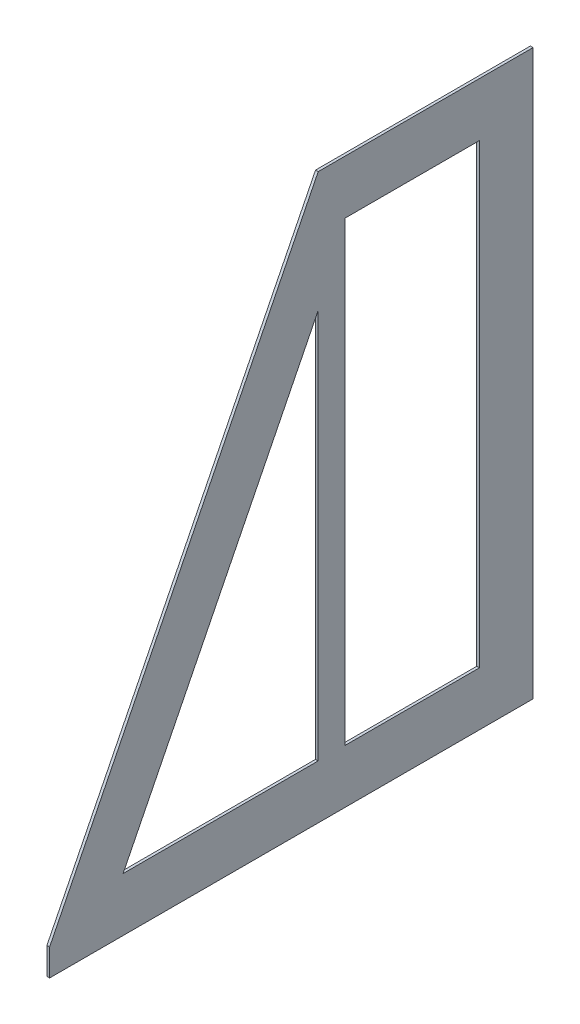
ISO-10303-21;
HEADER;
FILE_DESCRIPTION(('STEP AP214'),'2;1');
FILE_NAME('part.step','',(''),(''),'','','');
FILE_SCHEMA(('AUTOMOTIVE_DESIGN { 1 0 10303 214 1 1 1 1 }'));
ENDSEC;
DATA;
#1=APPLICATION_CONTEXT('core data for automotive mechanical design processes');
#2=APPLICATION_PROTOCOL_DEFINITION('international standard','automotive_design',2000,#1);
#3=PRODUCT_CONTEXT('',#1,'mechanical');
#4=PRODUCT('Part','Part','',(#3));
#5=PRODUCT_RELATED_PRODUCT_CATEGORY('part','',(#4));
#6=PRODUCT_DEFINITION_FORMATION('','',#4);
#7=PRODUCT_DEFINITION_CONTEXT('part definition',#1,'design');
#8=PRODUCT_DEFINITION('design','',#6,#7);
#9=PRODUCT_DEFINITION_SHAPE('','',#8);
#10=(LENGTH_UNIT() NAMED_UNIT(*) SI_UNIT(.MILLI.,.METRE.));
#11=(NAMED_UNIT(*) PLANE_ANGLE_UNIT() SI_UNIT($,.RADIAN.));
#12=(NAMED_UNIT(*) SI_UNIT($,.STERADIAN.) SOLID_ANGLE_UNIT());
#13=UNCERTAINTY_MEASURE_WITH_UNIT(LENGTH_MEASURE(1.E-05),#10,'distance_accuracy_value','');
#14=(GEOMETRIC_REPRESENTATION_CONTEXT(3) GLOBAL_UNCERTAINTY_ASSIGNED_CONTEXT((#13)) GLOBAL_UNIT_ASSIGNED_CONTEXT((#10,
#11,#12)) REPRESENTATION_CONTEXT('',''));
#15=CARTESIAN_POINT('',(0.,0.,0.));
#16=DIRECTION('',(0.,0.,1.));
#17=DIRECTION('',(1.,0.,0.));
#18=AXIS2_PLACEMENT_3D('',#15,#16,#17);
#19=CARTESIAN_POINT('',(2.54,0.,0.));
#20=DIRECTION('',(-1.,0.,0.));
#21=DIRECTION('',(0.,0.,1.));
#22=AXIS2_PLACEMENT_3D('',#19,#20,#21);
#23=PLANE('',#22);
#24=DIRECTION('',(0.,0.,1.));
#25=VECTOR('',#24,1.);
#26=CARTESIAN_POINT('',(2.54,336.442597926244,42.0659071977671));
#27=LINE('',#26,#25);
#28=CARTESIAN_POINT('',(2.54,336.442597926244,-84.9340928022328));
#29=VERTEX_POINT('',#28);
#30=CARTESIAN_POINT('',(2.54,336.442597926244,42.0659071977671));
#31=VERTEX_POINT('',#30);
#32=EDGE_CURVE('E151',#29,#31,#27,.T.);
#33=ORIENTED_EDGE('',*,*,#32,.F.);
#34=DIRECTION('',(0.,1.,0.));
#35=VECTOR('',#34,1.);
#36=CARTESIAN_POINT('',(2.54,336.442597926244,-84.9340928022328));
#37=LINE('',#36,#35);
#38=CARTESIAN_POINT('',(2.54,-95.3574020737564,-84.9340928022329));
#39=VERTEX_POINT('',#38);
#40=EDGE_CURVE('E159',#39,#29,#37,.T.);
#41=ORIENTED_EDGE('',*,*,#40,.F.);
#42=DIRECTION('',(0.,0.,-1.));
#43=VECTOR('',#42,1.);
#44=CARTESIAN_POINT('',(2.54,-95.3574020737564,-84.9340928022329));
#45=LINE('',#44,#43);
#46=CARTESIAN_POINT('',(2.54,-95.3574020737564,42.0659071977671));
#47=VERTEX_POINT('',#46);
#48=EDGE_CURVE('E156',#47,#39,#45,.T.);
#49=ORIENTED_EDGE('',*,*,#48,.F.);
#50=DIRECTION('',(0.,-1.,0.));
#51=VECTOR('',#50,1.);
#52=CARTESIAN_POINT('',(2.54,-95.3574020737564,42.0659071977671));
#53=LINE('',#52,#51);
#54=EDGE_CURVE('E153',#31,#47,#53,.T.);
#55=ORIENTED_EDGE('',*,*,#54,.F.);
#56=EDGE_LOOP('',(#33,#41,#49,#55));
#57=FACE_BOUND('',#56,.T.);
#58=DIRECTION('',(0.,-0.894427190999916,0.447213595499957));
#59=VECTOR('',#58,1.);
#60=CARTESIAN_POINT('',(2.54,-120.757402073757,321.465907197767));
#61=LINE('',#60,#59);
#62=CARTESIAN_POINT('',(2.54,387.242597926244,67.4659071977672));
#63=VERTEX_POINT('',#62);
#64=CARTESIAN_POINT('',(2.54,-120.757402073757,321.465907197767));
#65=VERTEX_POINT('',#64);
#66=EDGE_CURVE('E182',#63,#65,#61,.T.);
#67=ORIENTED_EDGE('',*,*,#66,.T.);
#68=DIRECTION('',(0.,-1.,0.));
#69=VECTOR('',#68,1.);
#70=CARTESIAN_POINT('',(2.54,-146.157402073756,321.465907197767));
#71=LINE('',#70,#69);
#72=CARTESIAN_POINT('',(2.54,-146.157402073756,321.465907197767));
#73=VERTEX_POINT('',#72);
#74=EDGE_CURVE('E185',#65,#73,#71,.T.);
#75=ORIENTED_EDGE('',*,*,#74,.T.);
#76=DIRECTION('',(0.,0.,-1.));
#77=VECTOR('',#76,1.);
#78=CARTESIAN_POINT('',(2.54,-146.157402073756,-135.734092802233));
#79=LINE('',#78,#77);
#80=CARTESIAN_POINT('',(2.54,-146.157402073756,-135.734092802233));
#81=VERTEX_POINT('',#80);
#82=EDGE_CURVE('E188',#73,#81,#79,.T.);
#83=ORIENTED_EDGE('',*,*,#82,.T.);
#84=DIRECTION('',(0.,1.,0.));
#85=VECTOR('',#84,1.);
#86=CARTESIAN_POINT('',(2.54,387.242597926244,-135.734092802233));
#87=LINE('',#86,#85);
#88=CARTESIAN_POINT('',(2.54,387.242597926244,-135.734092802233));
#89=VERTEX_POINT('',#88);
#90=EDGE_CURVE('E190',#81,#89,#87,.T.);
#91=ORIENTED_EDGE('',*,*,#90,.T.);
#92=DIRECTION('',(0.,0.,1.));
#93=VECTOR('',#92,1.);
#94=CARTESIAN_POINT('',(2.54,387.242597926244,67.4659071977672));
#95=LINE('',#94,#93);
#96=EDGE_CURVE('E192',#89,#63,#95,.T.);
#97=ORIENTED_EDGE('',*,*,#96,.T.);
#98=EDGE_LOOP('',(#67,#75,#83,#91,#97));
#99=FACE_BOUND('',#98,.T.);
#100=DIRECTION('',(0.,1.,0.));
#101=VECTOR('',#100,1.);
#102=CARTESIAN_POINT('',(2.54,-95.3574020737564,67.4659071977671));
#103=LINE('',#102,#101);
#104=CARTESIAN_POINT('',(2.54,-95.3574020737564,67.4659071977671));
#105=VERTEX_POINT('',#104);
#106=CARTESIAN_POINT('',(2.54,273.650344669254,67.4659071977671));
#107=VERTEX_POINT('',#106);
#108=EDGE_CURVE('E124',#105,#107,#103,.T.);
#109=ORIENTED_EDGE('',*,*,#108,.F.);
#110=DIRECTION('',(0.,0.,-1.));
#111=VECTOR('',#110,1.);
#112=CARTESIAN_POINT('',(2.54,-95.3574020737564,251.969780569272));
#113=LINE('',#112,#111);
#114=CARTESIAN_POINT('',(2.54,-95.3574020737564,251.969780569272));
#115=VERTEX_POINT('',#114);
#116=EDGE_CURVE('E141',#115,#105,#113,.T.);
#117=ORIENTED_EDGE('',*,*,#116,.F.);
#118=DIRECTION('',(0.,-0.894427190999916,0.447213595499958));
#119=VECTOR('',#118,1.);
#120=CARTESIAN_POINT('',(2.54,273.650344669254,67.4659071977671));
#121=LINE('',#120,#119);
#122=EDGE_CURVE('E132',#107,#115,#121,.T.);
#123=ORIENTED_EDGE('',*,*,#122,.F.);
#124=EDGE_LOOP('',(#109,#117,#123));
#125=FACE_BOUND('',#124,.T.);
#126=ADVANCED_FACE('F35',(#57,#99,#125),#23,.F.);
#127=CARTESIAN_POINT('',(0.,0.,0.));
#128=DIRECTION('',(-1.,0.,0.));
#129=DIRECTION('',(0.,0.,1.));
#130=AXIS2_PLACEMENT_3D('',#127,#128,#129);
#131=PLANE('',#130);
#132=DIRECTION('',(0.,-0.894427190999916,0.447213595499957));
#133=VECTOR('',#132,1.);
#134=CARTESIAN_POINT('',(0.,-120.757402073757,321.465907197767));
#135=LINE('',#134,#133);
#136=CARTESIAN_POINT('',(0.,387.242597926244,67.4659071977672));
#137=VERTEX_POINT('',#136);
#138=CARTESIAN_POINT('',(0.,-120.757402073757,321.465907197767));
#139=VERTEX_POINT('',#138);
#140=EDGE_CURVE('E181',#137,#139,#135,.T.);
#141=ORIENTED_EDGE('',*,*,#140,.F.);
#142=DIRECTION('',(0.,0.,1.));
#143=VECTOR('',#142,1.);
#144=CARTESIAN_POINT('',(0.,387.242597926244,67.4659071977672));
#145=LINE('',#144,#143);
#146=CARTESIAN_POINT('',(0.,387.242597926244,-135.734092802233));
#147=VERTEX_POINT('',#146);
#148=EDGE_CURVE('E186',#147,#137,#145,.T.);
#149=ORIENTED_EDGE('',*,*,#148,.F.);
#150=DIRECTION('',(0.,1.,0.));
#151=VECTOR('',#150,1.);
#152=CARTESIAN_POINT('',(0.,387.242597926244,-135.734092802233));
#153=LINE('',#152,#151);
#154=CARTESIAN_POINT('',(0.,-146.157402073756,-135.734092802233));
#155=VERTEX_POINT('',#154);
#156=EDGE_CURVE('E201',#155,#147,#153,.T.);
#157=ORIENTED_EDGE('',*,*,#156,.F.);
#158=DIRECTION('',(0.,0.,-1.));
#159=VECTOR('',#158,1.);
#160=CARTESIAN_POINT('',(0.,-146.157402073756,-135.734092802233));
#161=LINE('',#160,#159);
#162=CARTESIAN_POINT('',(0.,-146.157402073756,321.465907197767));
#163=VERTEX_POINT('',#162);
#164=EDGE_CURVE('E199',#163,#155,#161,.T.);
#165=ORIENTED_EDGE('',*,*,#164,.F.);
#166=DIRECTION('',(0.,-1.,0.));
#167=VECTOR('',#166,1.);
#168=CARTESIAN_POINT('',(0.,-146.157402073756,321.465907197767));
#169=LINE('',#168,#167);
#170=EDGE_CURVE('E197',#139,#163,#169,.T.);
#171=ORIENTED_EDGE('',*,*,#170,.F.);
#172=EDGE_LOOP('',(#141,#149,#157,#165,#171));
#173=FACE_BOUND('',#172,.T.);
#174=DIRECTION('',(0.,1.,0.));
#175=VECTOR('',#174,1.);
#176=CARTESIAN_POINT('',(0.,336.442597926244,-84.9340928022328));
#177=LINE('',#176,#175);
#178=CARTESIAN_POINT('',(0.,-95.3574020737564,-84.9340928022329));
#179=VERTEX_POINT('',#178);
#180=CARTESIAN_POINT('',(0.,336.442597926244,-84.9340928022328));
#181=VERTEX_POINT('',#180);
#182=EDGE_CURVE('E154',#179,#181,#177,.T.);
#183=ORIENTED_EDGE('',*,*,#182,.T.);
#184=DIRECTION('',(0.,0.,1.));
#185=VECTOR('',#184,1.);
#186=CARTESIAN_POINT('',(0.,336.442597926244,42.0659071977671));
#187=LINE('',#186,#185);
#188=CARTESIAN_POINT('',(0.,336.442597926244,42.0659071977671));
#189=VERTEX_POINT('',#188);
#190=EDGE_CURVE('E139',#181,#189,#187,.T.);
#191=ORIENTED_EDGE('',*,*,#190,.T.);
#192=DIRECTION('',(0.,-1.,0.));
#193=VECTOR('',#192,1.);
#194=CARTESIAN_POINT('',(0.,-95.3574020737564,42.0659071977671));
#195=LINE('',#194,#193);
#196=CARTESIAN_POINT('',(0.,-95.3574020737564,42.0659071977671));
#197=VERTEX_POINT('',#196);
#198=EDGE_CURVE('E164',#189,#197,#195,.T.);
#199=ORIENTED_EDGE('',*,*,#198,.T.);
#200=DIRECTION('',(0.,0.,-1.));
#201=VECTOR('',#200,1.);
#202=CARTESIAN_POINT('',(0.,-95.3574020737564,-84.9340928022329));
#203=LINE('',#202,#201);
#204=EDGE_CURVE('E167',#197,#179,#203,.T.);
#205=ORIENTED_EDGE('',*,*,#204,.T.);
#206=EDGE_LOOP('',(#183,#191,#199,#205));
#207=FACE_BOUND('',#206,.T.);
#208=DIRECTION('',(0.,0.,-1.));
#209=VECTOR('',#208,1.);
#210=CARTESIAN_POINT('',(0.,-95.3574020737564,251.969780569272));
#211=LINE('',#210,#209);
#212=CARTESIAN_POINT('',(0.,-95.3574020737564,251.969780569272));
#213=VERTEX_POINT('',#212);
#214=CARTESIAN_POINT('',(0.,-95.3574020737564,67.4659071977671));
#215=VERTEX_POINT('',#214);
#216=EDGE_CURVE('E133',#213,#215,#211,.T.);
#217=ORIENTED_EDGE('',*,*,#216,.T.);
#218=DIRECTION('',(0.,1.,0.));
#219=VECTOR('',#218,1.);
#220=CARTESIAN_POINT('',(0.,-95.3574020737564,67.4659071977671));
#221=LINE('',#220,#219);
#222=CARTESIAN_POINT('',(0.,273.650344669254,67.4659071977671));
#223=VERTEX_POINT('',#222);
#224=EDGE_CURVE('E58',#215,#223,#221,.T.);
#225=ORIENTED_EDGE('',*,*,#224,.T.);
#226=DIRECTION('',(0.,-0.894427190999916,0.447213595499958));
#227=VECTOR('',#226,1.);
#228=CARTESIAN_POINT('',(0.,273.650344669254,67.4659071977671));
#229=LINE('',#228,#227);
#230=EDGE_CURVE('E138',#223,#213,#229,.T.);
#231=ORIENTED_EDGE('',*,*,#230,.T.);
#232=EDGE_LOOP('',(#217,#225,#231));
#233=FACE_BOUND('',#232,.T.);
#234=ADVANCED_FACE('F222',(#173,#207,#233),#131,.T.);
#235=CARTESIAN_POINT('',(2.54,-120.757402073757,321.465907197767));
#236=DIRECTION('',(0.,-0.447213595499957,-0.894427190999916));
#237=DIRECTION('',(0.,0.894427190999916,-0.447213595499958));
#238=AXIS2_PLACEMENT_3D('',#235,#236,#237);
#239=PLANE('',#238);
#240=ORIENTED_EDGE('',*,*,#140,.T.);
#241=DIRECTION('',(-1.,0.,0.));
#242=VECTOR('',#241,1.);
#243=CARTESIAN_POINT('',(2.54,-120.757402073757,321.465907197767));
#244=LINE('',#243,#242);
#245=EDGE_CURVE('E11',#65,#139,#244,.T.);
#246=ORIENTED_EDGE('',*,*,#245,.F.);
#247=ORIENTED_EDGE('',*,*,#66,.F.);
#248=DIRECTION('',(-1.,0.,0.));
#249=VECTOR('',#248,1.);
#250=CARTESIAN_POINT('',(2.54,387.242597926244,67.4659071977672));
#251=LINE('',#250,#249);
#252=EDGE_CURVE('E194',#63,#137,#251,.T.);
#253=ORIENTED_EDGE('',*,*,#252,.T.);
#254=EDGE_LOOP('',(#240,#246,#247,#253));
#255=FACE_BOUND('',#254,.T.);
#256=ADVANCED_FACE('F37',(#255),#239,.F.);
#257=CARTESIAN_POINT('',(2.54,-146.157402073756,321.465907197767));
#258=DIRECTION('',(0.,0.,-1.));
#259=DIRECTION('',(0.,1.,0.));
#260=AXIS2_PLACEMENT_3D('',#257,#258,#259);
#261=PLANE('',#260);
#262=ORIENTED_EDGE('',*,*,#170,.T.);
#263=DIRECTION('',(-1.,0.,0.));
#264=VECTOR('',#263,1.);
#265=CARTESIAN_POINT('',(2.54,-146.157402073756,321.465907197767));
#266=LINE('',#265,#264);
#267=EDGE_CURVE('E43',#73,#163,#266,.T.);
#268=ORIENTED_EDGE('',*,*,#267,.F.);
#269=ORIENTED_EDGE('',*,*,#74,.F.);
#270=ORIENTED_EDGE('',*,*,#245,.T.);
#271=EDGE_LOOP('',(#262,#268,#269,#270));
#272=FACE_BOUND('',#271,.T.);
#273=ADVANCED_FACE('F236',(#272),#261,.F.);
#274=CARTESIAN_POINT('',(2.54,-146.157402073756,-135.734092802233));
#275=DIRECTION('',(0.,1.,0.));
#276=DIRECTION('',(0.,0.,1.));
#277=AXIS2_PLACEMENT_3D('',#274,#275,#276);
#278=PLANE('',#277);
#279=ORIENTED_EDGE('',*,*,#164,.T.);
#280=DIRECTION('',(-1.,0.,0.));
#281=VECTOR('',#280,1.);
#282=CARTESIAN_POINT('',(2.54,-146.157402073756,-135.734092802233));
#283=LINE('',#282,#281);
#284=EDGE_CURVE('E209',#81,#155,#283,.T.);
#285=ORIENTED_EDGE('',*,*,#284,.F.);
#286=ORIENTED_EDGE('',*,*,#82,.F.);
#287=ORIENTED_EDGE('',*,*,#267,.T.);
#288=EDGE_LOOP('',(#279,#285,#286,#287));
#289=FACE_BOUND('',#288,.T.);
#290=ADVANCED_FACE('F216',(#289),#278,.F.);
#291=CARTESIAN_POINT('',(2.54,387.242597926244,-135.734092802233));
#292=DIRECTION('',(0.,0.,1.));
#293=DIRECTION('',(0.,-1.,0.));
#294=AXIS2_PLACEMENT_3D('',#291,#292,#293);
#295=PLANE('',#294);
#296=ORIENTED_EDGE('',*,*,#156,.T.);
#297=DIRECTION('',(-1.,0.,0.));
#298=VECTOR('',#297,1.);
#299=CARTESIAN_POINT('',(2.54,387.242597926244,-135.734092802233));
#300=LINE('',#299,#298);
#301=EDGE_CURVE('E206',#89,#147,#300,.T.);
#302=ORIENTED_EDGE('',*,*,#301,.F.);
#303=ORIENTED_EDGE('',*,*,#90,.F.);
#304=ORIENTED_EDGE('',*,*,#284,.T.);
#305=EDGE_LOOP('',(#296,#302,#303,#304));
#306=FACE_BOUND('',#305,.T.);
#307=ADVANCED_FACE('F227',(#306),#295,.F.);
#308=CARTESIAN_POINT('',(2.54,387.242597926244,67.4659071977672));
#309=DIRECTION('',(0.,-1.,0.));
#310=DIRECTION('',(0.,0.,-1.));
#311=AXIS2_PLACEMENT_3D('',#308,#309,#310);
#312=PLANE('',#311);
#313=ORIENTED_EDGE('',*,*,#148,.T.);
#314=ORIENTED_EDGE('',*,*,#252,.F.);
#315=ORIENTED_EDGE('',*,*,#96,.F.);
#316=ORIENTED_EDGE('',*,*,#301,.T.);
#317=EDGE_LOOP('',(#313,#314,#315,#316));
#318=FACE_BOUND('',#317,.T.);
#319=ADVANCED_FACE('F231',(#318),#312,.F.);
#320=CARTESIAN_POINT('',(2.54,336.442597926244,42.0659071977671));
#321=DIRECTION('',(0.,-1.,0.));
#322=DIRECTION('',(0.,0.,-1.));
#323=AXIS2_PLACEMENT_3D('',#320,#321,#322);
#324=PLANE('',#323);
#325=ORIENTED_EDGE('',*,*,#190,.F.);
#326=DIRECTION('',(-1.,0.,0.));
#327=VECTOR('',#326,1.);
#328=CARTESIAN_POINT('',(2.54,336.442597926244,-84.9340928022328));
#329=LINE('',#328,#327);
#330=EDGE_CURVE('E161',#29,#181,#329,.T.);
#331=ORIENTED_EDGE('',*,*,#330,.F.);
#332=ORIENTED_EDGE('',*,*,#32,.T.);
#333=DIRECTION('',(-1.,0.,0.));
#334=VECTOR('',#333,1.);
#335=CARTESIAN_POINT('',(2.54,336.442597926244,42.0659071977671));
#336=LINE('',#335,#334);
#337=EDGE_CURVE('E178',#31,#189,#336,.T.);
#338=ORIENTED_EDGE('',*,*,#337,.T.);
#339=EDGE_LOOP('',(#325,#331,#332,#338));
#340=FACE_BOUND('',#339,.T.);
#341=ADVANCED_FACE('F251',(#340),#324,.T.);
#342=CARTESIAN_POINT('',(2.54,-95.3574020737564,42.0659071977671));
#343=DIRECTION('',(0.,0.,-1.));
#344=DIRECTION('',(-1.,0.,0.));
#345=AXIS2_PLACEMENT_3D('',#342,#343,#344);
#346=PLANE('',#345);
#347=ORIENTED_EDGE('',*,*,#198,.F.);
#348=ORIENTED_EDGE('',*,*,#337,.F.);
#349=ORIENTED_EDGE('',*,*,#54,.T.);
#350=DIRECTION('',(-1.,0.,0.));
#351=VECTOR('',#350,1.);
#352=CARTESIAN_POINT('',(2.54,-95.3574020737564,42.0659071977671));
#353=LINE('',#352,#351);
#354=EDGE_CURVE('E176',#47,#197,#353,.T.);
#355=ORIENTED_EDGE('',*,*,#354,.T.);
#356=EDGE_LOOP('',(#347,#348,#349,#355));
#357=FACE_BOUND('',#356,.T.);
#358=ADVANCED_FACE('F277',(#357),#346,.T.);
#359=CARTESIAN_POINT('',(2.54,-95.3574020737564,-84.9340928022329));
#360=DIRECTION('',(0.,1.,0.));
#361=DIRECTION('',(0.,0.,1.));
#362=AXIS2_PLACEMENT_3D('',#359,#360,#361);
#363=PLANE('',#362);
#364=ORIENTED_EDGE('',*,*,#204,.F.);
#365=ORIENTED_EDGE('',*,*,#354,.F.);
#366=ORIENTED_EDGE('',*,*,#48,.T.);
#367=DIRECTION('',(-1.,0.,0.));
#368=VECTOR('',#367,1.);
#369=CARTESIAN_POINT('',(2.54,-95.3574020737564,-84.9340928022329));
#370=LINE('',#369,#368);
#371=EDGE_CURVE('E174',#39,#179,#370,.T.);
#372=ORIENTED_EDGE('',*,*,#371,.T.);
#373=EDGE_LOOP('',(#364,#365,#366,#372));
#374=FACE_BOUND('',#373,.T.);
#375=ADVANCED_FACE('F284',(#374),#363,.T.);
#376=CARTESIAN_POINT('',(2.54,336.442597926244,-84.9340928022328));
#377=DIRECTION('',(0.,0.,1.));
#378=DIRECTION('',(0.,-1.,0.));
#379=AXIS2_PLACEMENT_3D('',#376,#377,#378);
#380=PLANE('',#379);
#381=ORIENTED_EDGE('',*,*,#182,.F.);
#382=ORIENTED_EDGE('',*,*,#371,.F.);
#383=ORIENTED_EDGE('',*,*,#40,.T.);
#384=ORIENTED_EDGE('',*,*,#330,.T.);
#385=EDGE_LOOP('',(#381,#382,#383,#384));
#386=FACE_BOUND('',#385,.T.);
#387=ADVANCED_FACE('F291',(#386),#380,.T.);
#388=CARTESIAN_POINT('',(2.54,-95.3574020737564,67.4659071977671));
#389=DIRECTION('',(0.,0.,1.));
#390=DIRECTION('',(1.,0.,0.));
#391=AXIS2_PLACEMENT_3D('',#388,#389,#390);
#392=PLANE('',#391);
#393=ORIENTED_EDGE('',*,*,#224,.F.);
#394=DIRECTION('',(-1.,0.,0.));
#395=VECTOR('',#394,1.);
#396=CARTESIAN_POINT('',(2.54,-95.3574020737564,67.4659071977671));
#397=LINE('',#396,#395);
#398=EDGE_CURVE('E128',#105,#215,#397,.T.);
#399=ORIENTED_EDGE('',*,*,#398,.F.);
#400=ORIENTED_EDGE('',*,*,#108,.T.);
#401=DIRECTION('',(-1.,0.,0.));
#402=VECTOR('',#401,1.);
#403=CARTESIAN_POINT('',(2.54,273.650344669254,67.4659071977671));
#404=LINE('',#403,#402);
#405=EDGE_CURVE('E127',#107,#223,#404,.T.);
#406=ORIENTED_EDGE('',*,*,#405,.T.);
#407=EDGE_LOOP('',(#393,#399,#400,#406));
#408=FACE_BOUND('',#407,.T.);
#409=ADVANCED_FACE('F126',(#408),#392,.T.);
#410=CARTESIAN_POINT('',(2.54,273.650344669254,67.4659071977671));
#411=DIRECTION('',(0.,-0.447213595499958,-0.894427190999916));
#412=DIRECTION('',(0.,0.894427190999916,-0.447213595499958));
#413=AXIS2_PLACEMENT_3D('',#410,#411,#412);
#414=PLANE('',#413);
#415=ORIENTED_EDGE('',*,*,#230,.F.);
#416=ORIENTED_EDGE('',*,*,#405,.F.);
#417=ORIENTED_EDGE('',*,*,#122,.T.);
#418=DIRECTION('',(-1.,0.,0.));
#419=VECTOR('',#418,1.);
#420=CARTESIAN_POINT('',(2.54,-95.3574020737564,251.969780569272));
#421=LINE('',#420,#419);
#422=EDGE_CURVE('E50',#115,#213,#421,.T.);
#423=ORIENTED_EDGE('',*,*,#422,.T.);
#424=EDGE_LOOP('',(#415,#416,#417,#423));
#425=FACE_BOUND('',#424,.T.);
#426=ADVANCED_FACE('F136',(#425),#414,.T.);
#427=CARTESIAN_POINT('',(2.54,-95.3574020737564,251.969780569272));
#428=DIRECTION('',(0.,1.,0.));
#429=DIRECTION('',(0.,0.,1.));
#430=AXIS2_PLACEMENT_3D('',#427,#428,#429);
#431=PLANE('',#430);
#432=ORIENTED_EDGE('',*,*,#216,.F.);
#433=ORIENTED_EDGE('',*,*,#422,.F.);
#434=ORIENTED_EDGE('',*,*,#116,.T.);
#435=ORIENTED_EDGE('',*,*,#398,.T.);
#436=EDGE_LOOP('',(#432,#433,#434,#435));
#437=FACE_BOUND('',#436,.T.);
#438=ADVANCED_FACE('F312',(#437),#431,.T.);
#439=CLOSED_SHELL('',(#126,#234,#256,#273,#290,#307,#319,#341,#358,#375,#387,#409,#426,#438));
#440=MANIFOLD_SOLID_BREP('B2',#439);
#441=ADVANCED_BREP_SHAPE_REPRESENTATION('',(#18,#440),#14);
#442=SHAPE_DEFINITION_REPRESENTATION(#9,#441);
ENDSEC;
END-ISO-10303-21;
